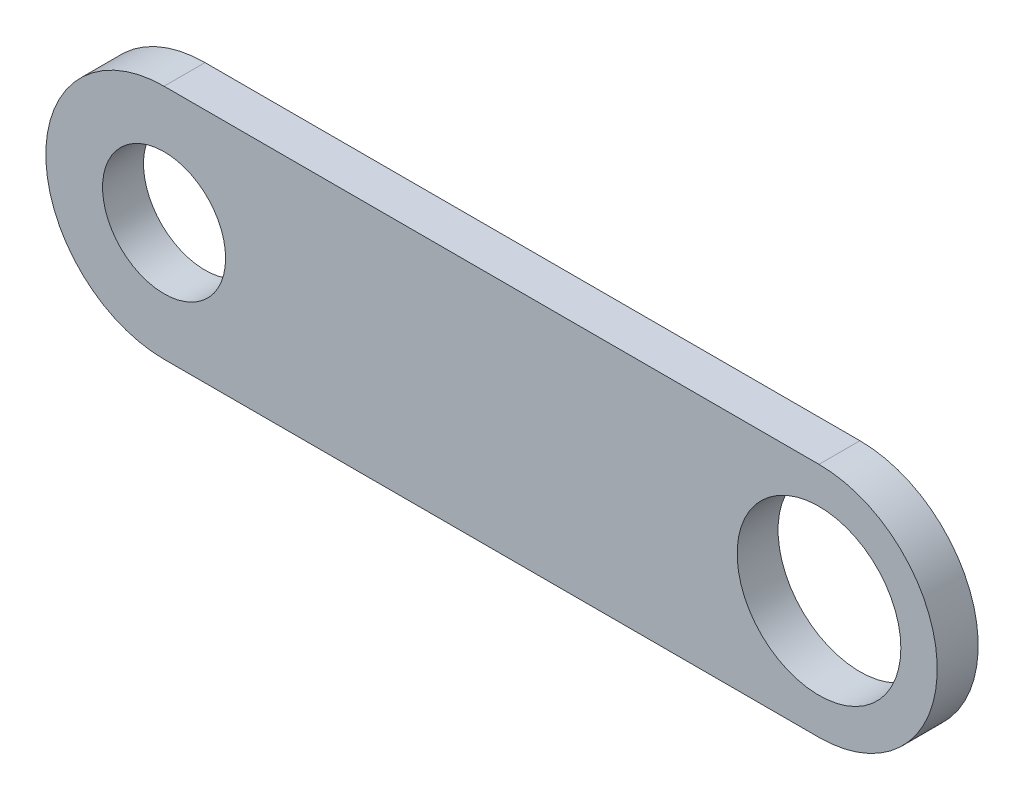
ISO-10303-21;
HEADER;
FILE_DESCRIPTION(('STEP AP214'),'2;1');
FILE_NAME('part.step','',(''),(''),'','','');
FILE_SCHEMA(('AUTOMOTIVE_DESIGN { 1 0 10303 214 1 1 1 1 }'));
ENDSEC;
DATA;
#1=APPLICATION_CONTEXT('core data for automotive mechanical design processes');
#2=APPLICATION_PROTOCOL_DEFINITION('international standard','automotive_design',2000,#1);
#3=PRODUCT_CONTEXT('',#1,'mechanical');
#4=PRODUCT('Part','Part','',(#3));
#5=PRODUCT_RELATED_PRODUCT_CATEGORY('part','',(#4));
#6=PRODUCT_DEFINITION_FORMATION('','',#4);
#7=PRODUCT_DEFINITION_CONTEXT('part definition',#1,'design');
#8=PRODUCT_DEFINITION('design','',#6,#7);
#9=PRODUCT_DEFINITION_SHAPE('','',#8);
#10=(LENGTH_UNIT() NAMED_UNIT(*) SI_UNIT(.MILLI.,.METRE.));
#11=(NAMED_UNIT(*) PLANE_ANGLE_UNIT() SI_UNIT($,.RADIAN.));
#12=(NAMED_UNIT(*) SI_UNIT($,.STERADIAN.) SOLID_ANGLE_UNIT());
#13=UNCERTAINTY_MEASURE_WITH_UNIT(LENGTH_MEASURE(1.E-05),#10,'distance_accuracy_value','');
#14=(GEOMETRIC_REPRESENTATION_CONTEXT(3) GLOBAL_UNCERTAINTY_ASSIGNED_CONTEXT((#13)) GLOBAL_UNIT_ASSIGNED_CONTEXT((#10,
#11,#12)) REPRESENTATION_CONTEXT('',''));
#15=CARTESIAN_POINT('',(0.,0.,0.));
#16=DIRECTION('',(0.,0.,1.));
#17=DIRECTION('',(1.,0.,0.));
#18=AXIS2_PLACEMENT_3D('',#15,#16,#17);
#19=CARTESIAN_POINT('',(-50.8,0.,3.175));
#20=DIRECTION('',(0.,0.,1.));
#21=DIRECTION('',(1.,0.,0.));
#22=AXIS2_PLACEMENT_3D('',#19,#20,#21);
#23=PLANE('',#22);
#24=CARTESIAN_POINT('',(50.8,0.,3.175));
#25=DIRECTION('',(0.,0.,1.));
#26=DIRECTION('',(1.,0.,0.));
#27=AXIS2_PLACEMENT_3D('',#24,#25,#26);
#28=CIRCLE('',#27,12.7);
#29=CARTESIAN_POINT('',(63.5,0.,3.175));
#30=VERTEX_POINT('',#29);
#31=EDGE_CURVE('E159',#30,#30,#28,.T.);
#32=ORIENTED_EDGE('',*,*,#31,.F.);
#33=EDGE_LOOP('',(#32));
#34=FACE_BOUND('',#33,.T.);
#35=CARTESIAN_POINT('',(-50.8,0.,3.175));
#36=DIRECTION('',(0.,0.,1.));
#37=DIRECTION('',(1.,0.,0.));
#38=AXIS2_PLACEMENT_3D('',#35,#36,#37);
#39=CIRCLE('',#38,18.3444444444444);
#40=CARTESIAN_POINT('',(-50.8,18.3444444444444,3.175));
#41=VERTEX_POINT('',#40);
#42=CARTESIAN_POINT('',(-50.8,-18.3444444444444,3.175));
#43=VERTEX_POINT('',#42);
#44=EDGE_CURVE('E136',#41,#43,#39,.T.);
#45=ORIENTED_EDGE('',*,*,#44,.T.);
#46=DIRECTION('',(1.,0.,0.));
#47=VECTOR('',#46,1.);
#48=CARTESIAN_POINT('',(-50.8,-18.3444444444444,3.175));
#49=LINE('',#48,#47);
#50=CARTESIAN_POINT('',(50.8,-18.3444444444444,3.175));
#51=VERTEX_POINT('',#50);
#52=EDGE_CURVE('E129',#43,#51,#49,.T.);
#53=ORIENTED_EDGE('',*,*,#52,.T.);
#54=CARTESIAN_POINT('',(50.8,0.,3.175));
#55=DIRECTION('',(0.,0.,1.));
#56=DIRECTION('',(1.,0.,0.));
#57=AXIS2_PLACEMENT_3D('',#54,#55,#56);
#58=CIRCLE('',#57,18.3444444444444);
#59=CARTESIAN_POINT('',(50.8,18.3444444444445,3.175));
#60=VERTEX_POINT('',#59);
#61=EDGE_CURVE('E135',#51,#60,#58,.T.);
#62=ORIENTED_EDGE('',*,*,#61,.T.);
#63=DIRECTION('',(1.,0.,0.));
#64=VECTOR('',#63,1.);
#65=CARTESIAN_POINT('',(-50.8,18.3444444444444,3.175));
#66=LINE('',#65,#64);
#67=EDGE_CURVE('E148',#41,#60,#66,.T.);
#68=ORIENTED_EDGE('',*,*,#67,.F.);
#69=EDGE_LOOP('',(#45,#53,#62,#68));
#70=FACE_BOUND('',#69,.T.);
#71=CARTESIAN_POINT('',(-50.8,0.,3.175));
#72=DIRECTION('',(0.,0.,1.));
#73=DIRECTION('',(1.,0.,0.));
#74=AXIS2_PLACEMENT_3D('',#71,#72,#73);
#75=CIRCLE('',#74,9.54405);
#76=CARTESIAN_POINT('',(-41.25595,0.,3.175));
#77=VERTEX_POINT('',#76);
#78=EDGE_CURVE('E203',#77,#77,#75,.T.);
#79=ORIENTED_EDGE('',*,*,#78,.F.);
#80=EDGE_LOOP('',(#79));
#81=FACE_BOUND('',#80,.T.);
#82=ADVANCED_FACE('F85',(#34,#70,#81),#23,.T.);
#83=CARTESIAN_POINT('',(-50.8,0.,-3.175));
#84=DIRECTION('',(0.,0.,1.));
#85=DIRECTION('',(1.,0.,0.));
#86=AXIS2_PLACEMENT_3D('',#83,#84,#85);
#87=PLANE('',#86);
#88=CARTESIAN_POINT('',(-50.8,0.,-3.175));
#89=DIRECTION('',(0.,0.,1.));
#90=DIRECTION('',(1.,0.,0.));
#91=AXIS2_PLACEMENT_3D('',#88,#89,#90);
#92=CIRCLE('',#91,18.3444444444444);
#93=CARTESIAN_POINT('',(-50.8,18.3444444444444,-3.175));
#94=VERTEX_POINT('',#93);
#95=CARTESIAN_POINT('',(-50.8,-18.3444444444444,-3.175));
#96=VERTEX_POINT('',#95);
#97=EDGE_CURVE('E156',#94,#96,#92,.T.);
#98=ORIENTED_EDGE('',*,*,#97,.F.);
#99=DIRECTION('',(1.,0.,0.));
#100=VECTOR('',#99,1.);
#101=CARTESIAN_POINT('',(-50.8,18.3444444444444,-3.175));
#102=LINE('',#101,#100);
#103=CARTESIAN_POINT('',(50.8,18.3444444444445,-3.175));
#104=VERTEX_POINT('',#103);
#105=EDGE_CURVE('E165',#94,#104,#102,.T.);
#106=ORIENTED_EDGE('',*,*,#105,.T.);
#107=CARTESIAN_POINT('',(50.8,0.,-3.175));
#108=DIRECTION('',(0.,0.,1.));
#109=DIRECTION('',(1.,0.,0.));
#110=AXIS2_PLACEMENT_3D('',#107,#108,#109);
#111=CIRCLE('',#110,18.3444444444444);
#112=CARTESIAN_POINT('',(50.8,-18.3444444444444,-3.175));
#113=VERTEX_POINT('',#112);
#114=EDGE_CURVE('E162',#113,#104,#111,.T.);
#115=ORIENTED_EDGE('',*,*,#114,.F.);
#116=DIRECTION('',(1.,0.,0.));
#117=VECTOR('',#116,1.);
#118=CARTESIAN_POINT('',(-50.8,-18.3444444444444,-3.175));
#119=LINE('',#118,#117);
#120=EDGE_CURVE('E142',#96,#113,#119,.T.);
#121=ORIENTED_EDGE('',*,*,#120,.F.);
#122=EDGE_LOOP('',(#98,#106,#115,#121));
#123=FACE_BOUND('',#122,.T.);
#124=CARTESIAN_POINT('',(50.8,0.,-3.175));
#125=DIRECTION('',(0.,0.,1.));
#126=DIRECTION('',(1.,0.,0.));
#127=AXIS2_PLACEMENT_3D('',#124,#125,#126);
#128=CIRCLE('',#127,12.7);
#129=CARTESIAN_POINT('',(63.5,0.,-3.175));
#130=VERTEX_POINT('',#129);
#131=EDGE_CURVE('E197',#130,#130,#128,.T.);
#132=ORIENTED_EDGE('',*,*,#131,.T.);
#133=EDGE_LOOP('',(#132));
#134=FACE_BOUND('',#133,.T.);
#135=CARTESIAN_POINT('',(-50.8,0.,-3.175));
#136=DIRECTION('',(0.,0.,1.));
#137=DIRECTION('',(1.,0.,0.));
#138=AXIS2_PLACEMENT_3D('',#135,#136,#137);
#139=CIRCLE('',#138,9.54405);
#140=CARTESIAN_POINT('',(-41.25595,0.,-3.175));
#141=VERTEX_POINT('',#140);
#142=EDGE_CURVE('E209',#141,#141,#139,.T.);
#143=ORIENTED_EDGE('',*,*,#142,.T.);
#144=EDGE_LOOP('',(#143));
#145=FACE_BOUND('',#144,.T.);
#146=ADVANCED_FACE('F218',(#123,#134,#145),#87,.F.);
#147=CARTESIAN_POINT('',(-50.8,0.,3.175));
#148=DIRECTION('',(0.,0.,-1.));
#149=DIRECTION('',(-1.,0.,0.));
#150=AXIS2_PLACEMENT_3D('',#147,#148,#149);
#151=CYLINDRICAL_SURFACE('',#150,18.3444444444444);
#152=ORIENTED_EDGE('',*,*,#97,.T.);
#153=DIRECTION('',(0.,0.,-1.));
#154=VECTOR('',#153,1.);
#155=CARTESIAN_POINT('',(-50.8,-18.3444444444444,3.175));
#156=LINE('',#155,#154);
#157=EDGE_CURVE('E14',#43,#96,#156,.T.);
#158=ORIENTED_EDGE('',*,*,#157,.F.);
#159=ORIENTED_EDGE('',*,*,#44,.F.);
#160=DIRECTION('',(0.,0.,-1.));
#161=VECTOR('',#160,1.);
#162=CARTESIAN_POINT('',(-50.8,18.3444444444444,3.175));
#163=LINE('',#162,#161);
#164=EDGE_CURVE('E103',#41,#94,#163,.T.);
#165=ORIENTED_EDGE('',*,*,#164,.T.);
#166=EDGE_LOOP('',(#152,#158,#159,#165));
#167=FACE_BOUND('',#166,.T.);
#168=ADVANCED_FACE('F87',(#167),#151,.T.);
#169=CARTESIAN_POINT('',(-50.8,-18.3444444444444,3.175));
#170=DIRECTION('',(0.,1.,0.));
#171=DIRECTION('',(-1.,0.,0.));
#172=AXIS2_PLACEMENT_3D('',#169,#170,#171);
#173=PLANE('',#172);
#174=ORIENTED_EDGE('',*,*,#120,.T.);
#175=DIRECTION('',(0.,0.,-1.));
#176=VECTOR('',#175,1.);
#177=CARTESIAN_POINT('',(50.8,-18.3444444444444,3.175));
#178=LINE('',#177,#176);
#179=EDGE_CURVE('E95',#51,#113,#178,.T.);
#180=ORIENTED_EDGE('',*,*,#179,.F.);
#181=ORIENTED_EDGE('',*,*,#52,.F.);
#182=ORIENTED_EDGE('',*,*,#157,.T.);
#183=EDGE_LOOP('',(#174,#180,#181,#182));
#184=FACE_BOUND('',#183,.T.);
#185=ADVANCED_FACE('F141',(#184),#173,.F.);
#186=CARTESIAN_POINT('',(50.8,0.,3.175));
#187=DIRECTION('',(0.,0.,-1.));
#188=DIRECTION('',(-1.,0.,0.));
#189=AXIS2_PLACEMENT_3D('',#186,#187,#188);
#190=CYLINDRICAL_SURFACE('',#189,18.3444444444444);
#191=ORIENTED_EDGE('',*,*,#114,.T.);
#192=DIRECTION('',(0.,0.,-1.));
#193=VECTOR('',#192,1.);
#194=CARTESIAN_POINT('',(50.8,18.3444444444445,3.175));
#195=LINE('',#194,#193);
#196=EDGE_CURVE('E118',#60,#104,#195,.T.);
#197=ORIENTED_EDGE('',*,*,#196,.F.);
#198=ORIENTED_EDGE('',*,*,#61,.F.);
#199=ORIENTED_EDGE('',*,*,#179,.T.);
#200=EDGE_LOOP('',(#191,#197,#198,#199));
#201=FACE_BOUND('',#200,.T.);
#202=ADVANCED_FACE('F146',(#201),#190,.T.);
#203=CARTESIAN_POINT('',(-50.8,18.3444444444444,3.175));
#204=DIRECTION('',(0.,1.,0.));
#205=DIRECTION('',(-1.,0.,0.));
#206=AXIS2_PLACEMENT_3D('',#203,#204,#205);
#207=PLANE('',#206);
#208=ORIENTED_EDGE('',*,*,#105,.F.);
#209=ORIENTED_EDGE('',*,*,#164,.F.);
#210=ORIENTED_EDGE('',*,*,#67,.T.);
#211=ORIENTED_EDGE('',*,*,#196,.T.);
#212=EDGE_LOOP('',(#208,#209,#210,#211));
#213=FACE_BOUND('',#212,.T.);
#214=ADVANCED_FACE('F228',(#213),#207,.T.);
#215=CARTESIAN_POINT('',(50.8,0.,3.175));
#216=DIRECTION('',(0.,0.,-1.));
#217=DIRECTION('',(-1.,0.,0.));
#218=AXIS2_PLACEMENT_3D('',#215,#216,#217);
#219=CYLINDRICAL_SURFACE('',#218,12.7);
#220=ORIENTED_EDGE('',*,*,#31,.T.);
#221=EDGE_LOOP('',(#220));
#222=FACE_BOUND('',#221,.T.);
#223=ORIENTED_EDGE('',*,*,#131,.F.);
#224=EDGE_LOOP('',(#223));
#225=FACE_BOUND('',#224,.T.);
#226=ADVANCED_FACE('F222',(#222,#225),#219,.F.);
#227=CARTESIAN_POINT('',(-50.8,0.,3.175));
#228=DIRECTION('',(0.,0.,-1.));
#229=DIRECTION('',(-1.,0.,0.));
#230=AXIS2_PLACEMENT_3D('',#227,#228,#229);
#231=CYLINDRICAL_SURFACE('',#230,9.54405);
#232=ORIENTED_EDGE('',*,*,#78,.T.);
#233=EDGE_LOOP('',(#232));
#234=FACE_BOUND('',#233,.T.);
#235=ORIENTED_EDGE('',*,*,#142,.F.);
#236=EDGE_LOOP('',(#235));
#237=FACE_BOUND('',#236,.T.);
#238=ADVANCED_FACE('F220',(#234,#237),#231,.F.);
#239=CLOSED_SHELL('',(#82,#146,#168,#185,#202,#214,#226,#238));
#240=MANIFOLD_SOLID_BREP('B2',#239);
#241=ADVANCED_BREP_SHAPE_REPRESENTATION('',(#18,#240),#14);
#242=SHAPE_DEFINITION_REPRESENTATION(#9,#241);
ENDSEC;
END-ISO-10303-21;
